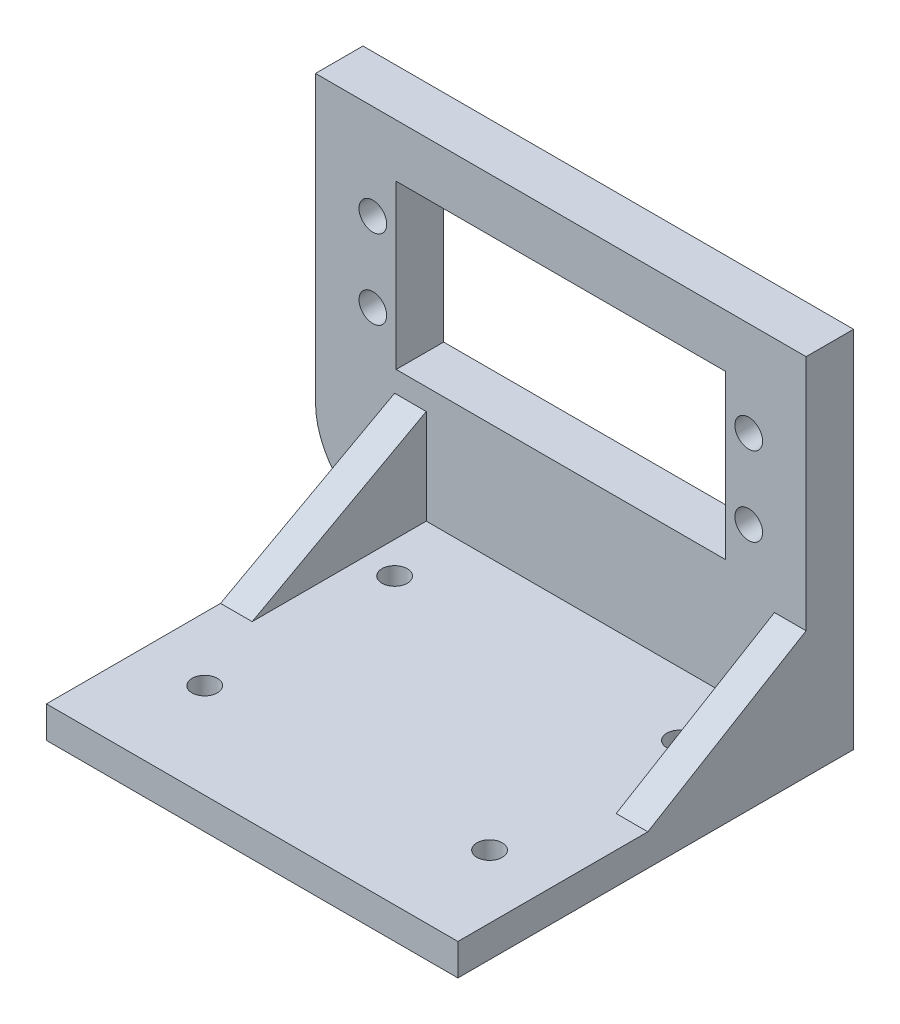
ISO-10303-21;
HEADER;
FILE_DESCRIPTION(('STEP AP214'),'2;1');
FILE_NAME('part.step','',(''),(''),'','','');
FILE_SCHEMA(('AUTOMOTIVE_DESIGN { 1 0 10303 214 1 1 1 1 }'));
ENDSEC;
DATA;
#1=APPLICATION_CONTEXT('core data for automotive mechanical design processes');
#2=APPLICATION_PROTOCOL_DEFINITION('international standard','automotive_design',2000,#1);
#3=PRODUCT_CONTEXT('',#1,'mechanical');
#4=PRODUCT('Part','Part','',(#3));
#5=PRODUCT_RELATED_PRODUCT_CATEGORY('part','',(#4));
#6=PRODUCT_DEFINITION_FORMATION('','',#4);
#7=PRODUCT_DEFINITION_CONTEXT('part definition',#1,'design');
#8=PRODUCT_DEFINITION('design','',#6,#7);
#9=PRODUCT_DEFINITION_SHAPE('','',#8);
#10=(LENGTH_UNIT() NAMED_UNIT(*) SI_UNIT(.MILLI.,.METRE.));
#11=(NAMED_UNIT(*) PLANE_ANGLE_UNIT() SI_UNIT($,.RADIAN.));
#12=(NAMED_UNIT(*) SI_UNIT($,.STERADIAN.) SOLID_ANGLE_UNIT());
#13=UNCERTAINTY_MEASURE_WITH_UNIT(LENGTH_MEASURE(1.E-05),#10,'distance_accuracy_value','');
#14=(GEOMETRIC_REPRESENTATION_CONTEXT(3) GLOBAL_UNCERTAINTY_ASSIGNED_CONTEXT((#13)) GLOBAL_UNIT_ASSIGNED_CONTEXT((#10,
#11,#12)) REPRESENTATION_CONTEXT('',''));
#15=CARTESIAN_POINT('',(0.,0.,0.));
#16=DIRECTION('',(0.,0.,1.));
#17=DIRECTION('',(1.,0.,0.));
#18=AXIS2_PLACEMENT_3D('',#15,#16,#17);
#19=CARTESIAN_POINT('',(-31.,46.,3.06382978723405));
#20=DIRECTION('',(0.,0.,-1.));
#21=DIRECTION('',(-1.,0.,0.));
#22=AXIS2_PLACEMENT_3D('',#19,#20,#21);
#23=PLANE('',#22);
#24=CARTESIAN_POINT('',(23.75,34.,3.06382978723405));
#25=DIRECTION('',(0.,0.,1.));
#26=DIRECTION('',(-1.,0.,0.));
#27=AXIS2_PLACEMENT_3D('',#24,#25,#26);
#28=CIRCLE('',#27,1.75);
#29=CARTESIAN_POINT('',(22.,34.,3.06382978723405));
#30=VERTEX_POINT('',#29);
#31=EDGE_CURVE('E206',#30,#30,#28,.T.);
#32=ORIENTED_EDGE('',*,*,#31,.F.);
#33=EDGE_LOOP('',(#32));
#34=FACE_BOUND('',#33,.T.);
#35=CARTESIAN_POINT('',(23.75,24.,3.06382978723405));
#36=DIRECTION('',(0.,0.,1.));
#37=DIRECTION('',(1.,0.,0.));
#38=AXIS2_PLACEMENT_3D('',#35,#36,#37);
#39=CIRCLE('',#38,1.75);
#40=CARTESIAN_POINT('',(25.5,24.,3.06382978723405));
#41=VERTEX_POINT('',#40);
#42=EDGE_CURVE('E205',#41,#41,#39,.T.);
#43=ORIENTED_EDGE('',*,*,#42,.F.);
#44=EDGE_LOOP('',(#43));
#45=FACE_BOUND('',#44,.T.);
#46=CARTESIAN_POINT('',(-23.75,24.,3.06382978723405));
#47=DIRECTION('',(0.,0.,1.));
#48=DIRECTION('',(-1.,0.,0.));
#49=AXIS2_PLACEMENT_3D('',#46,#47,#48);
#50=CIRCLE('',#49,1.75);
#51=CARTESIAN_POINT('',(-25.5,24.,3.06382978723405));
#52=VERTEX_POINT('',#51);
#53=EDGE_CURVE('E194',#52,#52,#50,.T.);
#54=ORIENTED_EDGE('',*,*,#53,.F.);
#55=EDGE_LOOP('',(#54));
#56=FACE_BOUND('',#55,.T.);
#57=CARTESIAN_POINT('',(-23.75,34.,3.06382978723405));
#58=DIRECTION('',(0.,0.,1.));
#59=DIRECTION('',(1.,0.,0.));
#60=AXIS2_PLACEMENT_3D('',#57,#58,#59);
#61=CIRCLE('',#60,1.75);
#62=CARTESIAN_POINT('',(-22.,34.,3.06382978723405));
#63=VERTEX_POINT('',#62);
#64=EDGE_CURVE('E199',#63,#63,#61,.T.);
#65=ORIENTED_EDGE('',*,*,#64,.F.);
#66=EDGE_LOOP('',(#65));
#67=FACE_BOUND('',#66,.T.);
#68=DIRECTION('',(1.,0.,0.));
#69=VECTOR('',#68,1.);
#70=CARTESIAN_POINT('',(-20.8,39.3,3.06382978723405));
#71=LINE('',#70,#69);
#72=CARTESIAN_POINT('',(-20.8,39.3,3.06382978723405));
#73=VERTEX_POINT('',#72);
#74=CARTESIAN_POINT('',(20.8,39.3,3.06382978723405));
#75=VERTEX_POINT('',#74);
#76=EDGE_CURVE('E216',#73,#75,#71,.T.);
#77=ORIENTED_EDGE('',*,*,#76,.T.);
#78=DIRECTION('',(0.,-1.,0.));
#79=VECTOR('',#78,1.);
#80=CARTESIAN_POINT('',(20.8,39.3,3.06382978723405));
#81=LINE('',#80,#79);
#82=CARTESIAN_POINT('',(20.8,18.7,3.06382978723405));
#83=VERTEX_POINT('',#82);
#84=EDGE_CURVE('E222',#75,#83,#81,.T.);
#85=ORIENTED_EDGE('',*,*,#84,.T.);
#86=DIRECTION('',(1.,0.,0.));
#87=VECTOR('',#86,1.);
#88=CARTESIAN_POINT('',(-20.8,18.7,3.06382978723405));
#89=LINE('',#88,#87);
#90=CARTESIAN_POINT('',(-20.8,18.7,3.06382978723405));
#91=VERTEX_POINT('',#90);
#92=EDGE_CURVE('E221',#91,#83,#89,.T.);
#93=ORIENTED_EDGE('',*,*,#92,.F.);
#94=DIRECTION('',(0.,-1.,0.));
#95=VECTOR('',#94,1.);
#96=CARTESIAN_POINT('',(-20.8,39.3,3.06382978723405));
#97=LINE('',#96,#95);
#98=EDGE_CURVE('E227',#73,#91,#97,.T.);
#99=ORIENTED_EDGE('',*,*,#98,.F.);
#100=EDGE_LOOP('',(#77,#85,#93,#99));
#101=FACE_BOUND('',#100,.T.);
#102=DIRECTION('',(0.,-1.,0.));
#103=VECTOR('',#102,1.);
#104=CARTESIAN_POINT('',(-31.,46.,3.06382978723405));
#105=LINE('',#104,#103);
#106=CARTESIAN_POINT('',(-31.,46.,3.06382978723405));
#107=VERTEX_POINT('',#106);
#108=CARTESIAN_POINT('',(-31.,10.,3.06382978723405));
#109=VERTEX_POINT('',#108);
#110=EDGE_CURVE('E268',#107,#109,#105,.T.);
#111=ORIENTED_EDGE('',*,*,#110,.T.);
#112=CARTESIAN_POINT('',(-21.,10.,3.06382978723405));
#113=DIRECTION('',(0.,0.,-1.));
#114=DIRECTION('',(-1.,0.,0.));
#115=AXIS2_PLACEMENT_3D('',#112,#113,#114);
#116=CIRCLE('',#115,10.);
#117=CARTESIAN_POINT('',(-21.,0.,3.06382978723405));
#118=VERTEX_POINT('',#117);
#119=EDGE_CURVE('E273',#109,#118,#116,.F.);
#120=ORIENTED_EDGE('',*,*,#119,.T.);
#121=DIRECTION('',(0.,-1.,0.));
#122=VECTOR('',#121,1.);
#123=CARTESIAN_POINT('',(-21.,0.,3.06382978723405));
#124=LINE('',#123,#122);
#125=CARTESIAN_POINT('',(-21.,16.,3.06382978723405));
#126=VERTEX_POINT('',#125);
#127=EDGE_CURVE('E173',#126,#118,#124,.T.);
#128=ORIENTED_EDGE('',*,*,#127,.F.);
#129=DIRECTION('',(-1.,0.,0.));
#130=VECTOR('',#129,1.);
#131=CARTESIAN_POINT('',(-17.,16.,3.06382978723405));
#132=LINE('',#131,#130);
#133=CARTESIAN_POINT('',(-17.,16.,3.06382978723405));
#134=VERTEX_POINT('',#133);
#135=EDGE_CURVE('E156',#134,#126,#132,.T.);
#136=ORIENTED_EDGE('',*,*,#135,.F.);
#137=DIRECTION('',(0.,-1.,0.));
#138=VECTOR('',#137,1.);
#139=CARTESIAN_POINT('',(-17.,3.99999999999999,3.06382978723405));
#140=LINE('',#139,#138);
#141=CARTESIAN_POINT('',(-17.,3.99999999999999,3.06382978723405));
#142=VERTEX_POINT('',#141);
#143=EDGE_CURVE('E154',#134,#142,#140,.T.);
#144=ORIENTED_EDGE('',*,*,#143,.T.);
#145=DIRECTION('',(-1.,0.,0.));
#146=VECTOR('',#145,1.);
#147=CARTESIAN_POINT('',(31.,4.,3.06382978723405));
#148=LINE('',#147,#146);
#149=CARTESIAN_POINT('',(27.,4.,3.06382978723405));
#150=VERTEX_POINT('',#149);
#151=EDGE_CURVE('E164',#150,#142,#148,.T.);
#152=ORIENTED_EDGE('',*,*,#151,.F.);
#153=DIRECTION('',(0.,1.,0.));
#154=VECTOR('',#153,1.);
#155=CARTESIAN_POINT('',(27.,4.,3.06382978723405));
#156=LINE('',#155,#154);
#157=CARTESIAN_POINT('',(27.,16.,3.06382978723405));
#158=VERTEX_POINT('',#157);
#159=EDGE_CURVE('E338',#150,#158,#156,.T.);
#160=ORIENTED_EDGE('',*,*,#159,.T.);
#161=DIRECTION('',(1.,0.,0.));
#162=VECTOR('',#161,1.);
#163=CARTESIAN_POINT('',(27.,16.,3.06382978723405));
#164=LINE('',#163,#162);
#165=CARTESIAN_POINT('',(31.,16.,3.06382978723405));
#166=VERTEX_POINT('',#165);
#167=EDGE_CURVE('E334',#158,#166,#164,.T.);
#168=ORIENTED_EDGE('',*,*,#167,.T.);
#169=DIRECTION('',(0.,-1.,0.));
#170=VECTOR('',#169,1.);
#171=CARTESIAN_POINT('',(31.,46.,3.06382978723405));
#172=LINE('',#171,#170);
#173=CARTESIAN_POINT('',(31.,46.,3.06382978723405));
#174=VERTEX_POINT('',#173);
#175=EDGE_CURVE('E270',#174,#166,#172,.T.);
#176=ORIENTED_EDGE('',*,*,#175,.F.);
#177=DIRECTION('',(1.,0.,0.));
#178=VECTOR('',#177,1.);
#179=CARTESIAN_POINT('',(-31.,46.,3.06382978723405));
#180=LINE('',#179,#178);
#181=EDGE_CURVE('E254',#107,#174,#180,.T.);
#182=ORIENTED_EDGE('',*,*,#181,.F.);
#183=EDGE_LOOP('',(#111,#120,#128,#136,#144,#152,#160,#168,#176,#182));
#184=FACE_BOUND('',#183,.T.);
#185=ADVANCED_FACE('F39',(#34,#45,#56,#67,#101,#184),#23,.F.);
#186=CARTESIAN_POINT('',(31.,4.,47.063829787234));
#187=DIRECTION('',(0.,-1.,0.));
#188=DIRECTION('',(1.,0.,0.));
#189=AXIS2_PLACEMENT_3D('',#186,#187,#188);
#190=PLANE('',#189);
#191=CARTESIAN_POINT('',(23.,4.,11.063829787234));
#192=DIRECTION('',(0.,-1.,0.));
#193=DIRECTION('',(1.,0.,0.));
#194=AXIS2_PLACEMENT_3D('',#191,#192,#193);
#195=CIRCLE('',#194,1.6);
#196=CARTESIAN_POINT('',(24.6,4.,11.063829787234));
#197=VERTEX_POINT('',#196);
#198=EDGE_CURVE('E319',#197,#197,#195,.T.);
#199=ORIENTED_EDGE('',*,*,#198,.T.);
#200=EDGE_LOOP('',(#199));
#201=FACE_BOUND('',#200,.T.);
#202=CARTESIAN_POINT('',(-13.,3.99999999999999,35.063829787234));
#203=DIRECTION('',(0.,-1.,0.));
#204=DIRECTION('',(1.,0.,0.));
#205=AXIS2_PLACEMENT_3D('',#202,#203,#204);
#206=CIRCLE('',#205,1.6);
#207=CARTESIAN_POINT('',(-11.4,3.99999999999999,35.063829787234));
#208=VERTEX_POINT('',#207);
#209=EDGE_CURVE('E324',#208,#208,#206,.T.);
#210=ORIENTED_EDGE('',*,*,#209,.T.);
#211=EDGE_LOOP('',(#210));
#212=FACE_BOUND('',#211,.T.);
#213=CARTESIAN_POINT('',(-13.,3.99999999999999,11.063829787234));
#214=DIRECTION('',(0.,1.,0.));
#215=DIRECTION('',(-1.,0.,0.));
#216=AXIS2_PLACEMENT_3D('',#213,#214,#215);
#217=CIRCLE('',#216,1.6);
#218=CARTESIAN_POINT('',(-14.6,3.99999999999999,11.063829787234));
#219=VERTEX_POINT('',#218);
#220=EDGE_CURVE('E179',#219,#219,#217,.T.);
#221=ORIENTED_EDGE('',*,*,#220,.F.);
#222=EDGE_LOOP('',(#221));
#223=FACE_BOUND('',#222,.T.);
#224=CARTESIAN_POINT('',(23.,4.,35.063829787234));
#225=DIRECTION('',(0.,1.,0.));
#226=DIRECTION('',(-1.,0.,0.));
#227=AXIS2_PLACEMENT_3D('',#224,#225,#226);
#228=CIRCLE('',#227,1.6);
#229=CARTESIAN_POINT('',(21.4,4.,35.063829787234));
#230=VERTEX_POINT('',#229);
#231=EDGE_CURVE('E312',#230,#230,#228,.T.);
#232=ORIENTED_EDGE('',*,*,#231,.F.);
#233=EDGE_LOOP('',(#232));
#234=FACE_BOUND('',#233,.T.);
#235=ORIENTED_EDGE('',*,*,#151,.T.);
#236=DIRECTION('',(0.,0.,1.));
#237=VECTOR('',#236,1.);
#238=CARTESIAN_POINT('',(-17.,3.99999999999999,25.063829787234));
#239=LINE('',#238,#237);
#240=CARTESIAN_POINT('',(-17.,3.99999999999999,25.063829787234));
#241=VERTEX_POINT('',#240);
#242=EDGE_CURVE('E149',#142,#241,#239,.T.);
#243=ORIENTED_EDGE('',*,*,#242,.T.);
#244=DIRECTION('',(-1.,0.,0.));
#245=VECTOR('',#244,1.);
#246=CARTESIAN_POINT('',(-17.,3.99999999999999,25.063829787234));
#247=LINE('',#246,#245);
#248=CARTESIAN_POINT('',(-21.,3.99999999999999,25.063829787234));
#249=VERTEX_POINT('',#248);
#250=EDGE_CURVE('E341',#241,#249,#247,.T.);
#251=ORIENTED_EDGE('',*,*,#250,.T.);
#252=DIRECTION('',(0.,0.,-1.));
#253=VECTOR('',#252,1.);
#254=CARTESIAN_POINT('',(-21.,3.99999999999999,47.063829787234));
#255=LINE('',#254,#253);
#256=CARTESIAN_POINT('',(-21.,3.99999999999999,47.063829787234));
#257=VERTEX_POINT('',#256);
#258=EDGE_CURVE('E189',#257,#249,#255,.T.);
#259=ORIENTED_EDGE('',*,*,#258,.F.);
#260=DIRECTION('',(-1.,0.,0.));
#261=VECTOR('',#260,1.);
#262=CARTESIAN_POINT('',(31.,4.,47.063829787234));
#263=LINE('',#262,#261);
#264=CARTESIAN_POINT('',(31.,4.,47.063829787234));
#265=VERTEX_POINT('',#264);
#266=EDGE_CURVE('E308',#265,#257,#263,.T.);
#267=ORIENTED_EDGE('',*,*,#266,.F.);
#268=DIRECTION('',(0.,0.,-1.));
#269=VECTOR('',#268,1.);
#270=CARTESIAN_POINT('',(31.,4.,47.063829787234));
#271=LINE('',#270,#269);
#272=CARTESIAN_POINT('',(31.,3.99999999999999,23.063829787234));
#273=VERTEX_POINT('',#272);
#274=EDGE_CURVE('E191',#265,#273,#271,.T.);
#275=ORIENTED_EDGE('',*,*,#274,.T.);
#276=DIRECTION('',(1.,0.,0.));
#277=VECTOR('',#276,1.);
#278=CARTESIAN_POINT('',(27.,3.99999999999999,23.063829787234));
#279=LINE('',#278,#277);
#280=CARTESIAN_POINT('',(27.,3.99999999999999,23.063829787234));
#281=VERTEX_POINT('',#280);
#282=EDGE_CURVE('E316',#281,#273,#279,.T.);
#283=ORIENTED_EDGE('',*,*,#282,.F.);
#284=DIRECTION('',(0.,0.,-1.));
#285=VECTOR('',#284,1.);
#286=CARTESIAN_POINT('',(27.,4.,3.06382978723405));
#287=LINE('',#286,#285);
#288=EDGE_CURVE('E175',#281,#150,#287,.T.);
#289=ORIENTED_EDGE('',*,*,#288,.T.);
#290=EDGE_LOOP('',(#235,#243,#251,#259,#267,#275,#283,#289));
#291=FACE_BOUND('',#290,.T.);
#292=ADVANCED_FACE('F169',(#201,#212,#223,#234,#291),#190,.F.);
#293=CARTESIAN_POINT('',(0.,0.,0.));
#294=DIRECTION('',(0.,1.,0.));
#295=DIRECTION('',(0.,0.,1.));
#296=AXIS2_PLACEMENT_3D('',#293,#294,#295);
#297=PLANE('',#296);
#298=CARTESIAN_POINT('',(23.,0.,35.063829787234));
#299=DIRECTION('',(0.,1.,0.));
#300=DIRECTION('',(-1.,0.,0.));
#301=AXIS2_PLACEMENT_3D('',#298,#299,#300);
#302=CIRCLE('',#301,1.6);
#303=CARTESIAN_POINT('',(21.4,0.,35.063829787234));
#304=VERTEX_POINT('',#303);
#305=EDGE_CURVE('E329',#304,#304,#302,.T.);
#306=ORIENTED_EDGE('',*,*,#305,.T.);
#307=EDGE_LOOP('',(#306));
#308=FACE_BOUND('',#307,.T.);
#309=CARTESIAN_POINT('',(-13.,0.,11.063829787234));
#310=DIRECTION('',(0.,1.,0.));
#311=DIRECTION('',(-1.,0.,0.));
#312=AXIS2_PLACEMENT_3D('',#309,#310,#311);
#313=CIRCLE('',#312,1.6);
#314=CARTESIAN_POINT('',(-14.6,0.,11.063829787234));
#315=VERTEX_POINT('',#314);
#316=EDGE_CURVE('E172',#315,#315,#313,.T.);
#317=ORIENTED_EDGE('',*,*,#316,.T.);
#318=EDGE_LOOP('',(#317));
#319=FACE_BOUND('',#318,.T.);
#320=DIRECTION('',(0.,0.,-1.));
#321=VECTOR('',#320,1.);
#322=CARTESIAN_POINT('',(-21.,0.,47.063829787234));
#323=LINE('',#322,#321);
#324=CARTESIAN_POINT('',(-21.,0.,47.063829787234));
#325=VERTEX_POINT('',#324);
#326=EDGE_CURVE('E187',#325,#118,#323,.T.);
#327=ORIENTED_EDGE('',*,*,#326,.T.);
#328=DIRECTION('',(0.,0.,1.));
#329=VECTOR('',#328,1.);
#330=CARTESIAN_POINT('',(-21.,0.,0.));
#331=LINE('',#330,#329);
#332=CARTESIAN_POINT('',(-21.,0.,-2.93617021276595));
#333=VERTEX_POINT('',#332);
#334=EDGE_CURVE('E50',#118,#333,#331,.F.);
#335=ORIENTED_EDGE('',*,*,#334,.T.);
#336=DIRECTION('',(-1.,0.,0.));
#337=VECTOR('',#336,1.);
#338=CARTESIAN_POINT('',(-31.,0.,-2.93617021276595));
#339=LINE('',#338,#337);
#340=CARTESIAN_POINT('',(31.,0.,-2.93617021276595));
#341=VERTEX_POINT('',#340);
#342=EDGE_CURVE('E251',#341,#333,#339,.T.);
#343=ORIENTED_EDGE('',*,*,#342,.F.);
#344=DIRECTION('',(0.,0.,-1.));
#345=VECTOR('',#344,1.);
#346=CARTESIAN_POINT('',(31.,0.,-2.93617021276595));
#347=LINE('',#346,#345);
#348=CARTESIAN_POINT('',(31.,0.,47.063829787234));
#349=VERTEX_POINT('',#348);
#350=EDGE_CURVE('E248',#349,#341,#347,.T.);
#351=ORIENTED_EDGE('',*,*,#350,.F.);
#352=DIRECTION('',(1.,0.,0.));
#353=VECTOR('',#352,1.);
#354=CARTESIAN_POINT('',(31.,0.,47.063829787234));
#355=LINE('',#354,#353);
#356=EDGE_CURVE('E182',#325,#349,#355,.T.);
#357=ORIENTED_EDGE('',*,*,#356,.F.);
#358=EDGE_LOOP('',(#327,#335,#343,#351,#357));
#359=FACE_BOUND('',#358,.T.);
#360=CARTESIAN_POINT('',(-13.,0.,35.063829787234));
#361=DIRECTION('',(0.,-1.,0.));
#362=DIRECTION('',(1.,0.,0.));
#363=AXIS2_PLACEMENT_3D('',#360,#361,#362);
#364=CIRCLE('',#363,1.6);
#365=CARTESIAN_POINT('',(-11.4,0.,35.063829787234));
#366=VERTEX_POINT('',#365);
#367=EDGE_CURVE('E325',#366,#366,#364,.T.);
#368=ORIENTED_EDGE('',*,*,#367,.F.);
#369=EDGE_LOOP('',(#368));
#370=FACE_BOUND('',#369,.T.);
#371=CARTESIAN_POINT('',(23.,0.,11.063829787234));
#372=DIRECTION('',(0.,-1.,0.));
#373=DIRECTION('',(1.,0.,0.));
#374=AXIS2_PLACEMENT_3D('',#371,#372,#373);
#375=CIRCLE('',#374,1.6);
#376=CARTESIAN_POINT('',(24.6,0.,11.063829787234));
#377=VERTEX_POINT('',#376);
#378=EDGE_CURVE('E314',#377,#377,#375,.T.);
#379=ORIENTED_EDGE('',*,*,#378,.F.);
#380=EDGE_LOOP('',(#379));
#381=FACE_BOUND('',#380,.T.);
#382=ADVANCED_FACE('F287',(#308,#319,#359,#370,#381),#297,.F.);
#383=CARTESIAN_POINT('',(-31.,46.,-2.93617021276595));
#384=DIRECTION('',(0.,0.,1.));
#385=DIRECTION('',(1.,0.,0.));
#386=AXIS2_PLACEMENT_3D('',#383,#384,#385);
#387=PLANE('',#386);
#388=CARTESIAN_POINT('',(23.75,34.,-2.93617021276595));
#389=DIRECTION('',(0.,0.,1.));
#390=DIRECTION('',(-1.,0.,0.));
#391=AXIS2_PLACEMENT_3D('',#388,#389,#390);
#392=CIRCLE('',#391,1.75);
#393=CARTESIAN_POINT('',(22.,34.,-2.93617021276595));
#394=VERTEX_POINT('',#393);
#395=EDGE_CURVE('E193',#394,#394,#392,.T.);
#396=ORIENTED_EDGE('',*,*,#395,.T.);
#397=EDGE_LOOP('',(#396));
#398=FACE_BOUND('',#397,.T.);
#399=CARTESIAN_POINT('',(23.75,24.,-2.93617021276595));
#400=DIRECTION('',(0.,0.,1.));
#401=DIRECTION('',(1.,0.,0.));
#402=AXIS2_PLACEMENT_3D('',#399,#400,#401);
#403=CIRCLE('',#402,1.75);
#404=CARTESIAN_POINT('',(25.5,24.,-2.93617021276595));
#405=VERTEX_POINT('',#404);
#406=EDGE_CURVE('E203',#405,#405,#403,.T.);
#407=ORIENTED_EDGE('',*,*,#406,.T.);
#408=EDGE_LOOP('',(#407));
#409=FACE_BOUND('',#408,.T.);
#410=CARTESIAN_POINT('',(-23.75,24.,-2.93617021276595));
#411=DIRECTION('',(0.,0.,1.));
#412=DIRECTION('',(-1.,0.,0.));
#413=AXIS2_PLACEMENT_3D('',#410,#411,#412);
#414=CIRCLE('',#413,1.75);
#415=CARTESIAN_POINT('',(-25.5,24.,-2.93617021276595));
#416=VERTEX_POINT('',#415);
#417=EDGE_CURVE('E198',#416,#416,#414,.T.);
#418=ORIENTED_EDGE('',*,*,#417,.T.);
#419=EDGE_LOOP('',(#418));
#420=FACE_BOUND('',#419,.T.);
#421=CARTESIAN_POINT('',(-23.75,34.,-2.93617021276595));
#422=DIRECTION('',(0.,0.,1.));
#423=DIRECTION('',(1.,0.,0.));
#424=AXIS2_PLACEMENT_3D('',#421,#422,#423);
#425=CIRCLE('',#424,1.75);
#426=CARTESIAN_POINT('',(-22.,34.,-2.93617021276595));
#427=VERTEX_POINT('',#426);
#428=EDGE_CURVE('E212',#427,#427,#425,.T.);
#429=ORIENTED_EDGE('',*,*,#428,.T.);
#430=EDGE_LOOP('',(#429));
#431=FACE_BOUND('',#430,.T.);
#432=ORIENTED_EDGE('',*,*,#342,.T.);
#433=CARTESIAN_POINT('',(-21.,10.,-2.93617021276595));
#434=DIRECTION('',(0.,0.,1.));
#435=DIRECTION('',(1.,0.,0.));
#436=AXIS2_PLACEMENT_3D('',#433,#434,#435);
#437=CIRCLE('',#436,10.);
#438=CARTESIAN_POINT('',(-31.,10.,-2.93617021276595));
#439=VERTEX_POINT('',#438);
#440=EDGE_CURVE('E11',#333,#439,#437,.F.);
#441=ORIENTED_EDGE('',*,*,#440,.T.);
#442=DIRECTION('',(0.,-1.,0.));
#443=VECTOR('',#442,1.);
#444=CARTESIAN_POINT('',(-31.,46.,-2.93617021276595));
#445=LINE('',#444,#443);
#446=CARTESIAN_POINT('',(-31.,46.,-2.93617021276595));
#447=VERTEX_POINT('',#446);
#448=EDGE_CURVE('E259',#447,#439,#445,.T.);
#449=ORIENTED_EDGE('',*,*,#448,.F.);
#450=DIRECTION('',(-1.,0.,0.));
#451=VECTOR('',#450,1.);
#452=CARTESIAN_POINT('',(-31.,46.,-2.93617021276595));
#453=LINE('',#452,#451);
#454=CARTESIAN_POINT('',(31.,46.,-2.93617021276595));
#455=VERTEX_POINT('',#454);
#456=EDGE_CURVE('E257',#455,#447,#453,.T.);
#457=ORIENTED_EDGE('',*,*,#456,.F.);
#458=DIRECTION('',(0.,-1.,0.));
#459=VECTOR('',#458,1.);
#460=CARTESIAN_POINT('',(31.,46.,-2.93617021276595));
#461=LINE('',#460,#459);
#462=EDGE_CURVE('E263',#455,#341,#461,.T.);
#463=ORIENTED_EDGE('',*,*,#462,.T.);
#464=EDGE_LOOP('',(#432,#441,#449,#457,#463));
#465=FACE_BOUND('',#464,.T.);
#466=DIRECTION('',(1.,0.,0.));
#467=VECTOR('',#466,1.);
#468=CARTESIAN_POINT('',(-20.8,39.3,-2.93617021276595));
#469=LINE('',#468,#467);
#470=CARTESIAN_POINT('',(-20.8,39.3,-2.93617021276595));
#471=VERTEX_POINT('',#470);
#472=CARTESIAN_POINT('',(20.8,39.3,-2.93617021276595));
#473=VERTEX_POINT('',#472);
#474=EDGE_CURVE('E229',#471,#473,#469,.T.);
#475=ORIENTED_EDGE('',*,*,#474,.F.);
#476=DIRECTION('',(0.,-1.,0.));
#477=VECTOR('',#476,1.);
#478=CARTESIAN_POINT('',(-20.8,39.3,-2.93617021276595));
#479=LINE('',#478,#477);
#480=CARTESIAN_POINT('',(-20.8,18.7,-2.93617021276595));
#481=VERTEX_POINT('',#480);
#482=EDGE_CURVE('E240',#471,#481,#479,.T.);
#483=ORIENTED_EDGE('',*,*,#482,.T.);
#484=DIRECTION('',(1.,0.,0.));
#485=VECTOR('',#484,1.);
#486=CARTESIAN_POINT('',(-20.8,18.7,-2.93617021276595));
#487=LINE('',#486,#485);
#488=CARTESIAN_POINT('',(20.8,18.7,-2.93617021276595));
#489=VERTEX_POINT('',#488);
#490=EDGE_CURVE('E234',#481,#489,#487,.T.);
#491=ORIENTED_EDGE('',*,*,#490,.T.);
#492=DIRECTION('',(0.,-1.,0.));
#493=VECTOR('',#492,1.);
#494=CARTESIAN_POINT('',(20.8,39.3,-2.93617021276595));
#495=LINE('',#494,#493);
#496=EDGE_CURVE('E235',#473,#489,#495,.T.);
#497=ORIENTED_EDGE('',*,*,#496,.F.);
#498=EDGE_LOOP('',(#475,#483,#491,#497));
#499=FACE_BOUND('',#498,.T.);
#500=ADVANCED_FACE('F291',(#398,#409,#420,#431,#465,#499),#387,.F.);
#501=CARTESIAN_POINT('',(-31.,46.,-2.93617021276595));
#502=DIRECTION('',(1.,0.,0.));
#503=DIRECTION('',(0.,0.,-1.));
#504=AXIS2_PLACEMENT_3D('',#501,#502,#503);
#505=PLANE('',#504);
#506=ORIENTED_EDGE('',*,*,#448,.T.);
#507=DIRECTION('',(0.,0.,1.));
#508=VECTOR('',#507,1.);
#509=CARTESIAN_POINT('',(-31.,10.,-2.93617021276595));
#510=LINE('',#509,#508);
#511=EDGE_CURVE('E275',#439,#109,#510,.T.);
#512=ORIENTED_EDGE('',*,*,#511,.T.);
#513=ORIENTED_EDGE('',*,*,#110,.F.);
#514=DIRECTION('',(0.,0.,1.));
#515=VECTOR('',#514,1.);
#516=CARTESIAN_POINT('',(-31.,46.,-2.93617021276595));
#517=LINE('',#516,#515);
#518=EDGE_CURVE('E249',#447,#107,#517,.T.);
#519=ORIENTED_EDGE('',*,*,#518,.F.);
#520=EDGE_LOOP('',(#506,#512,#513,#519));
#521=FACE_BOUND('',#520,.T.);
#522=ADVANCED_FACE('F288',(#521),#505,.F.);
#523=CARTESIAN_POINT('',(31.,46.,-2.93617021276595));
#524=DIRECTION('',(-1.,0.,0.));
#525=DIRECTION('',(0.,0.,1.));
#526=AXIS2_PLACEMENT_3D('',#523,#524,#525);
#527=PLANE('',#526);
#528=ORIENTED_EDGE('',*,*,#350,.T.);
#529=ORIENTED_EDGE('',*,*,#462,.F.);
#530=DIRECTION('',(0.,0.,-1.));
#531=VECTOR('',#530,1.);
#532=CARTESIAN_POINT('',(31.,46.,-2.93617021276595));
#533=LINE('',#532,#531);
#534=EDGE_CURVE('E256',#174,#455,#533,.T.);
#535=ORIENTED_EDGE('',*,*,#534,.F.);
#536=ORIENTED_EDGE('',*,*,#175,.T.);
#537=DIRECTION('',(0.,-0.514495755427527,0.857492925712544));
#538=VECTOR('',#537,1.);
#539=CARTESIAN_POINT('',(31.,3.99999999999999,23.063829787234));
#540=LINE('',#539,#538);
#541=EDGE_CURVE('E340',#166,#273,#540,.T.);
#542=ORIENTED_EDGE('',*,*,#541,.T.);
#543=ORIENTED_EDGE('',*,*,#274,.F.);
#544=DIRECTION('',(0.,1.,0.));
#545=VECTOR('',#544,1.);
#546=CARTESIAN_POINT('',(31.,0.,47.063829787234));
#547=LINE('',#546,#545);
#548=EDGE_CURVE('E180',#349,#265,#547,.T.);
#549=ORIENTED_EDGE('',*,*,#548,.F.);
#550=EDGE_LOOP('',(#528,#529,#535,#536,#542,#543,#549));
#551=FACE_BOUND('',#550,.T.);
#552=ADVANCED_FACE('F301',(#551),#527,.F.);
#553=CARTESIAN_POINT('',(0.,46.,0.));
#554=DIRECTION('',(0.,1.,0.));
#555=DIRECTION('',(0.,0.,1.));
#556=AXIS2_PLACEMENT_3D('',#553,#554,#555);
#557=PLANE('',#556);
#558=ORIENTED_EDGE('',*,*,#518,.T.);
#559=ORIENTED_EDGE('',*,*,#181,.T.);
#560=ORIENTED_EDGE('',*,*,#534,.T.);
#561=ORIENTED_EDGE('',*,*,#456,.T.);
#562=EDGE_LOOP('',(#558,#559,#560,#561));
#563=FACE_BOUND('',#562,.T.);
#564=ADVANCED_FACE('F300',(#563),#557,.T.);
#565=CARTESIAN_POINT('',(-20.8,39.3,-2.93617021276595));
#566=DIRECTION('',(0.,-1.,0.));
#567=DIRECTION('',(0.,0.,-1.));
#568=AXIS2_PLACEMENT_3D('',#565,#566,#567);
#569=PLANE('',#568);
#570=DIRECTION('',(0.,0.,1.));
#571=VECTOR('',#570,1.);
#572=CARTESIAN_POINT('',(-20.8,39.3,-2.93617021276595));
#573=LINE('',#572,#571);
#574=EDGE_CURVE('E239',#471,#73,#573,.T.);
#575=ORIENTED_EDGE('',*,*,#574,.F.);
#576=ORIENTED_EDGE('',*,*,#474,.T.);
#577=DIRECTION('',(0.,0.,1.));
#578=VECTOR('',#577,1.);
#579=CARTESIAN_POINT('',(20.8,39.3,-2.93617021276595));
#580=LINE('',#579,#578);
#581=EDGE_CURVE('E250',#473,#75,#580,.T.);
#582=ORIENTED_EDGE('',*,*,#581,.T.);
#583=ORIENTED_EDGE('',*,*,#76,.F.);
#584=EDGE_LOOP('',(#575,#576,#582,#583));
#585=FACE_BOUND('',#584,.T.);
#586=ADVANCED_FACE('F395',(#585),#569,.T.);
#587=CARTESIAN_POINT('',(20.8,39.3,-2.93617021276595));
#588=DIRECTION('',(-1.,0.,0.));
#589=DIRECTION('',(0.,0.,1.));
#590=AXIS2_PLACEMENT_3D('',#587,#588,#589);
#591=PLANE('',#590);
#592=ORIENTED_EDGE('',*,*,#581,.F.);
#593=ORIENTED_EDGE('',*,*,#496,.T.);
#594=DIRECTION('',(0.,0.,1.));
#595=VECTOR('',#594,1.);
#596=CARTESIAN_POINT('',(20.8,18.7,-2.93617021276595));
#597=LINE('',#596,#595);
#598=EDGE_CURVE('E244',#489,#83,#597,.T.);
#599=ORIENTED_EDGE('',*,*,#598,.T.);
#600=ORIENTED_EDGE('',*,*,#84,.F.);
#601=EDGE_LOOP('',(#592,#593,#599,#600));
#602=FACE_BOUND('',#601,.T.);
#603=ADVANCED_FACE('F399',(#602),#591,.T.);
#604=CARTESIAN_POINT('',(-20.8,18.7,-2.93617021276595));
#605=DIRECTION('',(0.,-1.,0.));
#606=DIRECTION('',(0.,0.,-1.));
#607=AXIS2_PLACEMENT_3D('',#604,#605,#606);
#608=PLANE('',#607);
#609=ORIENTED_EDGE('',*,*,#598,.F.);
#610=ORIENTED_EDGE('',*,*,#490,.F.);
#611=DIRECTION('',(0.,0.,1.));
#612=VECTOR('',#611,1.);
#613=CARTESIAN_POINT('',(-20.8,18.7,-2.93617021276595));
#614=LINE('',#613,#612);
#615=EDGE_CURVE('E243',#481,#91,#614,.T.);
#616=ORIENTED_EDGE('',*,*,#615,.T.);
#617=ORIENTED_EDGE('',*,*,#92,.T.);
#618=EDGE_LOOP('',(#609,#610,#616,#617));
#619=FACE_BOUND('',#618,.T.);
#620=ADVANCED_FACE('F405',(#619),#608,.F.);
#621=CARTESIAN_POINT('',(-20.8,39.3,-2.93617021276595));
#622=DIRECTION('',(-1.,0.,0.));
#623=DIRECTION('',(0.,0.,1.));
#624=AXIS2_PLACEMENT_3D('',#621,#622,#623);
#625=PLANE('',#624);
#626=ORIENTED_EDGE('',*,*,#615,.F.);
#627=ORIENTED_EDGE('',*,*,#482,.F.);
#628=ORIENTED_EDGE('',*,*,#574,.T.);
#629=ORIENTED_EDGE('',*,*,#98,.T.);
#630=EDGE_LOOP('',(#626,#627,#628,#629));
#631=FACE_BOUND('',#630,.T.);
#632=ADVANCED_FACE('F406',(#631),#625,.F.);
#633=CARTESIAN_POINT('',(-23.75,34.,-2.93617021276595));
#634=DIRECTION('',(0.,0.,1.));
#635=DIRECTION('',(1.,0.,0.));
#636=AXIS2_PLACEMENT_3D('',#633,#634,#635);
#637=CYLINDRICAL_SURFACE('',#636,1.75);
#638=ORIENTED_EDGE('',*,*,#428,.F.);
#639=EDGE_LOOP('',(#638));
#640=FACE_BOUND('',#639,.T.);
#641=ORIENTED_EDGE('',*,*,#64,.T.);
#642=EDGE_LOOP('',(#641));
#643=FACE_BOUND('',#642,.T.);
#644=ADVANCED_FACE('F409',(#640,#643),#637,.F.);
#645=CARTESIAN_POINT('',(-23.75,24.,-2.93617021276595));
#646=DIRECTION('',(0.,0.,1.));
#647=DIRECTION('',(1.,0.,0.));
#648=AXIS2_PLACEMENT_3D('',#645,#646,#647);
#649=CYLINDRICAL_SURFACE('',#648,1.75);
#650=ORIENTED_EDGE('',*,*,#417,.F.);
#651=EDGE_LOOP('',(#650));
#652=FACE_BOUND('',#651,.T.);
#653=ORIENTED_EDGE('',*,*,#53,.T.);
#654=EDGE_LOOP('',(#653));
#655=FACE_BOUND('',#654,.T.);
#656=ADVANCED_FACE('F413',(#652,#655),#649,.F.);
#657=CARTESIAN_POINT('',(23.75,24.,-2.93617021276595));
#658=DIRECTION('',(0.,0.,1.));
#659=DIRECTION('',(1.,0.,0.));
#660=AXIS2_PLACEMENT_3D('',#657,#658,#659);
#661=CYLINDRICAL_SURFACE('',#660,1.75);
#662=ORIENTED_EDGE('',*,*,#406,.F.);
#663=EDGE_LOOP('',(#662));
#664=FACE_BOUND('',#663,.T.);
#665=ORIENTED_EDGE('',*,*,#42,.T.);
#666=EDGE_LOOP('',(#665));
#667=FACE_BOUND('',#666,.T.);
#668=ADVANCED_FACE('F416',(#664,#667),#661,.F.);
#669=CARTESIAN_POINT('',(23.75,34.,-2.93617021276595));
#670=DIRECTION('',(0.,0.,1.));
#671=DIRECTION('',(1.,0.,0.));
#672=AXIS2_PLACEMENT_3D('',#669,#670,#671);
#673=CYLINDRICAL_SURFACE('',#672,1.75);
#674=ORIENTED_EDGE('',*,*,#395,.F.);
#675=EDGE_LOOP('',(#674));
#676=FACE_BOUND('',#675,.T.);
#677=ORIENTED_EDGE('',*,*,#31,.T.);
#678=EDGE_LOOP('',(#677));
#679=FACE_BOUND('',#678,.T.);
#680=ADVANCED_FACE('F417',(#676,#679),#673,.F.);
#681=CARTESIAN_POINT('',(-21.,0.,47.063829787234));
#682=DIRECTION('',(1.,0.,0.));
#683=DIRECTION('',(0.,0.,-1.));
#684=AXIS2_PLACEMENT_3D('',#681,#682,#683);
#685=PLANE('',#684);
#686=ORIENTED_EDGE('',*,*,#127,.T.);
#687=ORIENTED_EDGE('',*,*,#326,.F.);
#688=DIRECTION('',(0.,-1.,0.));
#689=VECTOR('',#688,1.);
#690=CARTESIAN_POINT('',(-21.,0.,47.063829787234));
#691=LINE('',#690,#689);
#692=EDGE_CURVE('E310',#257,#325,#691,.T.);
#693=ORIENTED_EDGE('',*,*,#692,.F.);
#694=ORIENTED_EDGE('',*,*,#258,.T.);
#695=DIRECTION('',(0.,0.478852130680574,-0.877895572914384));
#696=VECTOR('',#695,1.);
#697=CARTESIAN_POINT('',(-21.,16.,3.06382978723405));
#698=LINE('',#697,#696);
#699=EDGE_CURVE('E285',#249,#126,#698,.T.);
#700=ORIENTED_EDGE('',*,*,#699,.T.);
#701=EDGE_LOOP('',(#686,#687,#693,#694,#700));
#702=FACE_BOUND('',#701,.T.);
#703=ADVANCED_FACE('F282',(#702),#685,.F.);
#704=CARTESIAN_POINT('',(0.,0.,47.063829787234));
#705=DIRECTION('',(0.,0.,1.));
#706=DIRECTION('',(1.,0.,0.));
#707=AXIS2_PLACEMENT_3D('',#704,#705,#706);
#708=PLANE('',#707);
#709=ORIENTED_EDGE('',*,*,#548,.T.);
#710=ORIENTED_EDGE('',*,*,#266,.T.);
#711=ORIENTED_EDGE('',*,*,#692,.T.);
#712=ORIENTED_EDGE('',*,*,#356,.T.);
#713=EDGE_LOOP('',(#709,#710,#711,#712));
#714=FACE_BOUND('',#713,.T.);
#715=ADVANCED_FACE('F306',(#714),#708,.T.);
#716=CARTESIAN_POINT('',(-13.,0.,11.063829787234));
#717=DIRECTION('',(0.,1.,0.));
#718=DIRECTION('',(-1.,0.,0.));
#719=AXIS2_PLACEMENT_3D('',#716,#717,#718);
#720=CYLINDRICAL_SURFACE('',#719,1.6);
#721=ORIENTED_EDGE('',*,*,#316,.F.);
#722=EDGE_LOOP('',(#721));
#723=FACE_BOUND('',#722,.T.);
#724=ORIENTED_EDGE('',*,*,#220,.T.);
#725=EDGE_LOOP('',(#724));
#726=FACE_BOUND('',#725,.T.);
#727=ADVANCED_FACE('F427',(#723,#726),#720,.F.);
#728=CARTESIAN_POINT('',(23.,0.,35.063829787234));
#729=DIRECTION('',(0.,1.,0.));
#730=DIRECTION('',(-1.,0.,0.));
#731=AXIS2_PLACEMENT_3D('',#728,#729,#730);
#732=CYLINDRICAL_SURFACE('',#731,1.6);
#733=ORIENTED_EDGE('',*,*,#305,.F.);
#734=EDGE_LOOP('',(#733));
#735=FACE_BOUND('',#734,.T.);
#736=ORIENTED_EDGE('',*,*,#231,.T.);
#737=EDGE_LOOP('',(#736));
#738=FACE_BOUND('',#737,.T.);
#739=ADVANCED_FACE('F433',(#735,#738),#732,.F.);
#740=CARTESIAN_POINT('',(-13.,0.,35.063829787234));
#741=DIRECTION('',(0.,1.,0.));
#742=DIRECTION('',(-1.,0.,0.));
#743=AXIS2_PLACEMENT_3D('',#740,#741,#742);
#744=CYLINDRICAL_SURFACE('',#743,1.6);
#745=ORIENTED_EDGE('',*,*,#367,.T.);
#746=EDGE_LOOP('',(#745));
#747=FACE_BOUND('',#746,.T.);
#748=ORIENTED_EDGE('',*,*,#209,.F.);
#749=EDGE_LOOP('',(#748));
#750=FACE_BOUND('',#749,.T.);
#751=ADVANCED_FACE('F440',(#747,#750),#744,.F.);
#752=CARTESIAN_POINT('',(23.,0.,11.063829787234));
#753=DIRECTION('',(0.,1.,0.));
#754=DIRECTION('',(-1.,0.,0.));
#755=AXIS2_PLACEMENT_3D('',#752,#753,#754);
#756=CYLINDRICAL_SURFACE('',#755,1.6);
#757=ORIENTED_EDGE('',*,*,#378,.T.);
#758=EDGE_LOOP('',(#757));
#759=FACE_BOUND('',#758,.T.);
#760=ORIENTED_EDGE('',*,*,#198,.F.);
#761=EDGE_LOOP('',(#760));
#762=FACE_BOUND('',#761,.T.);
#763=ADVANCED_FACE('F362',(#759,#762),#756,.F.);
#764=CARTESIAN_POINT('',(27.,3.99999999999999,23.063829787234));
#765=DIRECTION('',(0.,0.857492925712544,0.514495755427527));
#766=DIRECTION('',(0.,-0.514495755427527,0.857492925712544));
#767=AXIS2_PLACEMENT_3D('',#764,#765,#766);
#768=PLANE('',#767);
#769=ORIENTED_EDGE('',*,*,#541,.F.);
#770=ORIENTED_EDGE('',*,*,#167,.F.);
#771=DIRECTION('',(0.,-0.514495755427527,0.857492925712544));
#772=VECTOR('',#771,1.);
#773=CARTESIAN_POINT('',(27.,3.99999999999999,23.063829787234));
#774=LINE('',#773,#772);
#775=EDGE_CURVE('E342',#158,#281,#774,.T.);
#776=ORIENTED_EDGE('',*,*,#775,.T.);
#777=ORIENTED_EDGE('',*,*,#282,.T.);
#778=EDGE_LOOP('',(#769,#770,#776,#777));
#779=FACE_BOUND('',#778,.T.);
#780=ADVANCED_FACE('F354',(#779),#768,.T.);
#781=CARTESIAN_POINT('',(27.,0.,0.));
#782=DIRECTION('',(1.,0.,0.));
#783=DIRECTION('',(0.,0.,-1.));
#784=AXIS2_PLACEMENT_3D('',#781,#782,#783);
#785=PLANE('',#784);
#786=ORIENTED_EDGE('',*,*,#159,.F.);
#787=ORIENTED_EDGE('',*,*,#288,.F.);
#788=ORIENTED_EDGE('',*,*,#775,.F.);
#789=EDGE_LOOP('',(#786,#787,#788));
#790=FACE_BOUND('',#789,.T.);
#791=ADVANCED_FACE('F358',(#790),#785,.F.);
#792=CARTESIAN_POINT('',(-17.,16.,3.06382978723405));
#793=DIRECTION('',(0.,0.877895572914384,0.478852130680574));
#794=DIRECTION('',(0.,-0.478852130680574,0.877895572914384));
#795=AXIS2_PLACEMENT_3D('',#792,#793,#794);
#796=PLANE('',#795);
#797=ORIENTED_EDGE('',*,*,#699,.F.);
#798=ORIENTED_EDGE('',*,*,#250,.F.);
#799=DIRECTION('',(0.,0.478852130680574,-0.877895572914384));
#800=VECTOR('',#799,1.);
#801=CARTESIAN_POINT('',(-17.,16.,3.06382978723405));
#802=LINE('',#801,#800);
#803=EDGE_CURVE('E155',#241,#134,#802,.T.);
#804=ORIENTED_EDGE('',*,*,#803,.T.);
#805=ORIENTED_EDGE('',*,*,#135,.T.);
#806=EDGE_LOOP('',(#797,#798,#804,#805));
#807=FACE_BOUND('',#806,.T.);
#808=ADVANCED_FACE('F350',(#807),#796,.T.);
#809=CARTESIAN_POINT('',(-17.,0.,0.));
#810=DIRECTION('',(-1.,0.,0.));
#811=DIRECTION('',(0.,0.,1.));
#812=AXIS2_PLACEMENT_3D('',#809,#810,#811);
#813=PLANE('',#812);
#814=ORIENTED_EDGE('',*,*,#803,.F.);
#815=ORIENTED_EDGE('',*,*,#242,.F.);
#816=ORIENTED_EDGE('',*,*,#143,.F.);
#817=EDGE_LOOP('',(#814,#815,#816));
#818=FACE_BOUND('',#817,.T.);
#819=ADVANCED_FACE('F152',(#818),#813,.F.);
#820=CARTESIAN_POINT('',(-21.,10.,-2.93617021276595));
#821=DIRECTION('',(0.,0.,1.));
#822=DIRECTION('',(1.,0.,0.));
#823=AXIS2_PLACEMENT_3D('',#820,#821,#822);
#824=CYLINDRICAL_SURFACE('',#823,10.);
#825=ORIENTED_EDGE('',*,*,#440,.F.);
#826=ORIENTED_EDGE('',*,*,#334,.F.);
#827=ORIENTED_EDGE('',*,*,#119,.F.);
#828=ORIENTED_EDGE('',*,*,#511,.F.);
#829=EDGE_LOOP('',(#825,#826,#827,#828));
#830=FACE_BOUND('',#829,.T.);
#831=ADVANCED_FACE('F41',(#830),#824,.T.);
#832=CLOSED_SHELL('',(#185,#292,#382,#500,#522,#552,#564,#586,#603,#620,#632,#644,#656,#668,
#680,#703,#715,#727,#739,#751,#763,#780,#791,#808,#819,#831));
#833=MANIFOLD_SOLID_BREP('B2',#832);
#834=ADVANCED_BREP_SHAPE_REPRESENTATION('',(#18,#833),#14);
#835=SHAPE_DEFINITION_REPRESENTATION(#9,#834);
ENDSEC;
END-ISO-10303-21;
